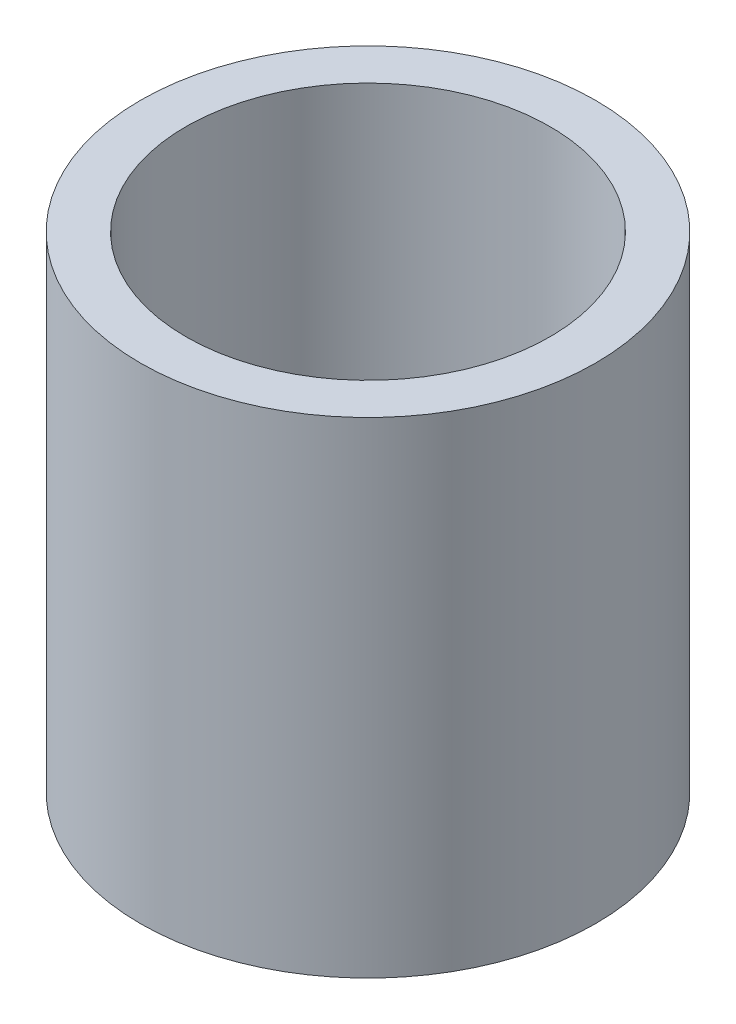
ISO-10303-21;
HEADER;
FILE_DESCRIPTION(('STEP AP214'),'2;1');
FILE_NAME('part.step','',(''),(''),'','','');
FILE_SCHEMA(('AUTOMOTIVE_DESIGN { 1 0 10303 214 1 1 1 1 }'));
ENDSEC;
DATA;
#1=APPLICATION_CONTEXT('core data for automotive mechanical design processes');
#2=APPLICATION_PROTOCOL_DEFINITION('international standard','automotive_design',2000,#1);
#3=PRODUCT_CONTEXT('',#1,'mechanical');
#4=PRODUCT('Part','Part','',(#3));
#5=PRODUCT_RELATED_PRODUCT_CATEGORY('part','',(#4));
#6=PRODUCT_DEFINITION_FORMATION('','',#4);
#7=PRODUCT_DEFINITION_CONTEXT('part definition',#1,'design');
#8=PRODUCT_DEFINITION('design','',#6,#7);
#9=PRODUCT_DEFINITION_SHAPE('','',#8);
#10=(LENGTH_UNIT() NAMED_UNIT(*) SI_UNIT(.MILLI.,.METRE.));
#11=(NAMED_UNIT(*) PLANE_ANGLE_UNIT() SI_UNIT($,.RADIAN.));
#12=(NAMED_UNIT(*) SI_UNIT($,.STERADIAN.) SOLID_ANGLE_UNIT());
#13=UNCERTAINTY_MEASURE_WITH_UNIT(LENGTH_MEASURE(1.E-05),#10,'distance_accuracy_value','');
#14=(GEOMETRIC_REPRESENTATION_CONTEXT(3) GLOBAL_UNCERTAINTY_ASSIGNED_CONTEXT((#13)) GLOBAL_UNIT_ASSIGNED_CONTEXT((#10,
#11,#12)) REPRESENTATION_CONTEXT('',''));
#15=CARTESIAN_POINT('',(0.,0.,0.));
#16=DIRECTION('',(0.,0.,1.));
#17=DIRECTION('',(1.,0.,0.));
#18=AXIS2_PLACEMENT_3D('',#15,#16,#17);
#19=CARTESIAN_POINT('',(0.,2.,0.));
#20=DIRECTION('',(0.,-1.,0.));
#21=DIRECTION('',(0.,0.,-1.));
#22=AXIS2_PLACEMENT_3D('',#19,#20,#21);
#23=CYLINDRICAL_SURFACE('',#22,15.);
#24=CARTESIAN_POINT('',(0.,0.,0.));
#25=DIRECTION('',(0.,1.,0.));
#26=DIRECTION('',(0.,0.,1.));
#27=AXIS2_PLACEMENT_3D('',#24,#25,#26);
#28=CIRCLE('',#27,15.);
#29=CARTESIAN_POINT('',(0.,0.,15.));
#30=VERTEX_POINT('',#29);
#31=EDGE_CURVE('E49',#30,#30,#28,.T.);
#32=ORIENTED_EDGE('',*,*,#31,.T.);
#33=EDGE_LOOP('',(#32));
#34=FACE_BOUND('',#33,.T.);
#35=CARTESIAN_POINT('',(0.,32.,0.));
#36=DIRECTION('',(0.,1.,0.));
#37=DIRECTION('',(0.,0.,1.));
#38=AXIS2_PLACEMENT_3D('',#35,#36,#37);
#39=CIRCLE('',#38,15.);
#40=CARTESIAN_POINT('',(0.,32.,15.));
#41=VERTEX_POINT('',#40);
#42=EDGE_CURVE('E47',#41,#41,#39,.T.);
#43=ORIENTED_EDGE('',*,*,#42,.F.);
#44=EDGE_LOOP('',(#43));
#45=FACE_BOUND('',#44,.T.);
#46=ADVANCED_FACE('F33',(#34,#45),#23,.T.);
#47=CARTESIAN_POINT('',(0.,2.,0.));
#48=DIRECTION('',(0.,-1.,0.));
#49=DIRECTION('',(0.,0.,-1.));
#50=AXIS2_PLACEMENT_3D('',#47,#48,#49);
#51=CYLINDRICAL_SURFACE('',#50,3.3);
#52=CARTESIAN_POINT('',(0.,2.,0.));
#53=DIRECTION('',(0.,1.,0.));
#54=DIRECTION('',(0.,0.,1.));
#55=AXIS2_PLACEMENT_3D('',#52,#53,#54);
#56=CIRCLE('',#55,3.3);
#57=CARTESIAN_POINT('',(0.,2.,3.3));
#58=VERTEX_POINT('',#57);
#59=EDGE_CURVE('E40',#58,#58,#56,.T.);
#60=ORIENTED_EDGE('',*,*,#59,.T.);
#61=EDGE_LOOP('',(#60));
#62=FACE_BOUND('',#61,.T.);
#63=CARTESIAN_POINT('',(0.,0.,0.));
#64=DIRECTION('',(0.,1.,0.));
#65=DIRECTION('',(0.,0.,1.));
#66=AXIS2_PLACEMENT_3D('',#63,#64,#65);
#67=CIRCLE('',#66,3.3);
#68=CARTESIAN_POINT('',(0.,0.,3.3));
#69=VERTEX_POINT('',#68);
#70=EDGE_CURVE('E36',#69,#69,#67,.T.);
#71=ORIENTED_EDGE('',*,*,#70,.F.);
#72=EDGE_LOOP('',(#71));
#73=FACE_BOUND('',#72,.T.);
#74=ADVANCED_FACE('F72',(#62,#73),#51,.F.);
#75=CARTESIAN_POINT('',(0.,2.,0.));
#76=DIRECTION('',(0.,1.,0.));
#77=DIRECTION('',(0.,0.,1.));
#78=AXIS2_PLACEMENT_3D('',#75,#76,#77);
#79=PLANE('',#78);
#80=CARTESIAN_POINT('',(0.,2.,0.));
#81=DIRECTION('',(0.,1.,0.));
#82=DIRECTION('',(0.,0.,1.));
#83=AXIS2_PLACEMENT_3D('',#80,#81,#82);
#84=CIRCLE('',#83,12.);
#85=CARTESIAN_POINT('',(0.,2.,12.));
#86=VERTEX_POINT('',#85);
#87=EDGE_CURVE('E10',#86,#86,#84,.F.);
#88=ORIENTED_EDGE('',*,*,#87,.F.);
#89=EDGE_LOOP('',(#88));
#90=FACE_BOUND('',#89,.T.);
#91=ORIENTED_EDGE('',*,*,#59,.F.);
#92=EDGE_LOOP('',(#91));
#93=FACE_BOUND('',#92,.T.);
#94=ADVANCED_FACE('F76',(#90,#93),#79,.T.);
#95=CARTESIAN_POINT('',(0.,0.,0.));
#96=DIRECTION('',(0.,1.,0.));
#97=DIRECTION('',(0.,0.,1.));
#98=AXIS2_PLACEMENT_3D('',#95,#96,#97);
#99=PLANE('',#98);
#100=ORIENTED_EDGE('',*,*,#70,.T.);
#101=EDGE_LOOP('',(#100));
#102=FACE_BOUND('',#101,.T.);
#103=ORIENTED_EDGE('',*,*,#31,.F.);
#104=EDGE_LOOP('',(#103));
#105=FACE_BOUND('',#104,.T.);
#106=ADVANCED_FACE('F69',(#102,#105),#99,.F.);
#107=CARTESIAN_POINT('',(0.,32.,0.));
#108=DIRECTION('',(0.,-1.,0.));
#109=DIRECTION('',(0.,0.,-1.));
#110=AXIS2_PLACEMENT_3D('',#107,#108,#109);
#111=CYLINDRICAL_SURFACE('',#110,12.);
#112=ORIENTED_EDGE('',*,*,#87,.T.);
#113=EDGE_LOOP('',(#112));
#114=FACE_BOUND('',#113,.T.);
#115=CARTESIAN_POINT('',(0.,32.,0.));
#116=DIRECTION('',(0.,1.,0.));
#117=DIRECTION('',(0.,0.,1.));
#118=AXIS2_PLACEMENT_3D('',#115,#116,#117);
#119=CIRCLE('',#118,12.);
#120=CARTESIAN_POINT('',(0.,32.,12.));
#121=VERTEX_POINT('',#120);
#122=EDGE_CURVE('E55',#121,#121,#119,.T.);
#123=ORIENTED_EDGE('',*,*,#122,.T.);
#124=EDGE_LOOP('',(#123));
#125=FACE_BOUND('',#124,.T.);
#126=ADVANCED_FACE('F61',(#114,#125),#111,.F.);
#127=CARTESIAN_POINT('',(0.,32.,0.));
#128=DIRECTION('',(0.,1.,0.));
#129=DIRECTION('',(0.,0.,1.));
#130=AXIS2_PLACEMENT_3D('',#127,#128,#129);
#131=PLANE('',#130);
#132=ORIENTED_EDGE('',*,*,#122,.F.);
#133=EDGE_LOOP('',(#132));
#134=FACE_BOUND('',#133,.T.);
#135=ORIENTED_EDGE('',*,*,#42,.T.);
#136=EDGE_LOOP('',(#135));
#137=FACE_BOUND('',#136,.T.);
#138=ADVANCED_FACE('F63',(#134,#137),#131,.T.);
#139=CLOSED_SHELL('',(#46,#74,#94,#106,#126,#138));
#140=MANIFOLD_SOLID_BREP('B2',#139);
#141=ADVANCED_BREP_SHAPE_REPRESENTATION('',(#18,#140),#14);
#142=SHAPE_DEFINITION_REPRESENTATION(#9,#141);
ENDSEC;
END-ISO-10303-21;
